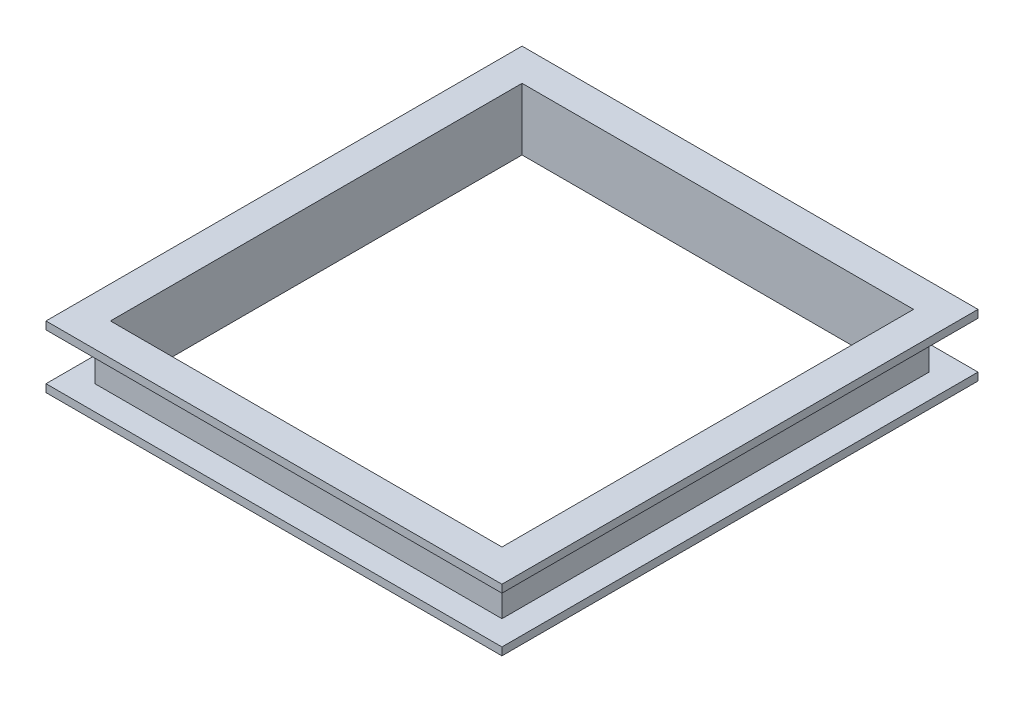
ISO-10303-21;
HEADER;
FILE_DESCRIPTION(('STEP AP214'),'2;1');
FILE_NAME('part.step','',(''),(''),'','','');
FILE_SCHEMA(('AUTOMOTIVE_DESIGN { 1 0 10303 214 1 1 1 1 }'));
ENDSEC;
DATA;
#1=APPLICATION_CONTEXT('core data for automotive mechanical design processes');
#2=APPLICATION_PROTOCOL_DEFINITION('international standard','automotive_design',2000,#1);
#3=PRODUCT_CONTEXT('',#1,'mechanical');
#4=PRODUCT('Part','Part','',(#3));
#5=PRODUCT_RELATED_PRODUCT_CATEGORY('part','',(#4));
#6=PRODUCT_DEFINITION_FORMATION('','',#4);
#7=PRODUCT_DEFINITION_CONTEXT('part definition',#1,'design');
#8=PRODUCT_DEFINITION('design','',#6,#7);
#9=PRODUCT_DEFINITION_SHAPE('','',#8);
#10=(LENGTH_UNIT() NAMED_UNIT(*) SI_UNIT(.MILLI.,.METRE.));
#11=(NAMED_UNIT(*) PLANE_ANGLE_UNIT() SI_UNIT($,.RADIAN.));
#12=(NAMED_UNIT(*) SI_UNIT($,.STERADIAN.) SOLID_ANGLE_UNIT());
#13=UNCERTAINTY_MEASURE_WITH_UNIT(LENGTH_MEASURE(1.E-05),#10,'distance_accuracy_value','');
#14=(GEOMETRIC_REPRESENTATION_CONTEXT(3) GLOBAL_UNCERTAINTY_ASSIGNED_CONTEXT((#13)) GLOBAL_UNIT_ASSIGNED_CONTEXT((#10,
#11,#12)) REPRESENTATION_CONTEXT('',''));
#15=CARTESIAN_POINT('',(0.,0.,0.));
#16=DIRECTION('',(0.,0.,1.));
#17=DIRECTION('',(1.,0.,0.));
#18=AXIS2_PLACEMENT_3D('',#15,#16,#17);
#19=CARTESIAN_POINT('',(0.,8.,0.));
#20=DIRECTION('',(0.,-1.,0.));
#21=DIRECTION('',(0.,0.,-1.));
#22=AXIS2_PLACEMENT_3D('',#19,#20,#21);
#23=PLANE('',#22);
#24=DIRECTION('',(0.,0.,1.));
#25=VECTOR('',#24,1.);
#26=CARTESIAN_POINT('',(-4.15055655745279,8.,0.));
#27=LINE('',#26,#25);
#28=CARTESIAN_POINT('',(-4.15055655745279,8.,-57.19));
#29=VERTEX_POINT('',#28);
#30=CARTESIAN_POINT('',(-4.15055655745279,8.,4.15));
#31=VERTEX_POINT('',#30);
#32=EDGE_CURVE('E271',#29,#31,#27,.T.);
#33=ORIENTED_EDGE('',*,*,#32,.T.);
#34=DIRECTION('',(1.,0.,0.));
#35=VECTOR('',#34,1.);
#36=CARTESIAN_POINT('',(0.,8.,4.15));
#37=LINE('',#36,#35);
#38=CARTESIAN_POINT('',(54.6,8.,4.15));
#39=VERTEX_POINT('',#38);
#40=EDGE_CURVE('E160',#31,#39,#37,.T.);
#41=ORIENTED_EDGE('',*,*,#40,.T.);
#42=DIRECTION('',(0.,0.,-1.));
#43=VECTOR('',#42,1.);
#44=CARTESIAN_POINT('',(54.6,8.,0.));
#45=LINE('',#44,#43);
#46=CARTESIAN_POINT('',(54.6,8.,-57.19));
#47=VERTEX_POINT('',#46);
#48=EDGE_CURVE('E169',#39,#47,#45,.T.);
#49=ORIENTED_EDGE('',*,*,#48,.T.);
#50=DIRECTION('',(-1.,0.,0.));
#51=VECTOR('',#50,1.);
#52=CARTESIAN_POINT('',(0.,8.,-57.19));
#53=LINE('',#52,#51);
#54=EDGE_CURVE('E277',#47,#29,#53,.T.);
#55=ORIENTED_EDGE('',*,*,#54,.T.);
#56=EDGE_LOOP('',(#33,#41,#49,#55));
#57=FACE_BOUND('',#56,.T.);
#58=DIRECTION('',(0.,0.,1.));
#59=VECTOR('',#58,1.);
#60=CARTESIAN_POINT('',(0.,8.,0.));
#61=LINE('',#60,#59);
#62=CARTESIAN_POINT('',(0.,8.,-53.04));
#63=VERTEX_POINT('',#62);
#64=CARTESIAN_POINT('',(0.,8.,0.));
#65=VERTEX_POINT('',#64);
#66=EDGE_CURVE('E201',#63,#65,#61,.T.);
#67=ORIENTED_EDGE('',*,*,#66,.F.);
#68=DIRECTION('',(-1.,0.,0.));
#69=VECTOR('',#68,1.);
#70=CARTESIAN_POINT('',(0.,8.,-53.04));
#71=LINE('',#70,#69);
#72=CARTESIAN_POINT('',(50.45,8.,-53.04));
#73=VERTEX_POINT('',#72);
#74=EDGE_CURVE('E209',#73,#63,#71,.T.);
#75=ORIENTED_EDGE('',*,*,#74,.F.);
#76=DIRECTION('',(0.,0.,-1.));
#77=VECTOR('',#76,1.);
#78=CARTESIAN_POINT('',(50.45,8.,0.));
#79=LINE('',#78,#77);
#80=CARTESIAN_POINT('',(50.45,8.,0.));
#81=VERTEX_POINT('',#80);
#82=EDGE_CURVE('E206',#81,#73,#79,.T.);
#83=ORIENTED_EDGE('',*,*,#82,.F.);
#84=DIRECTION('',(1.,0.,0.));
#85=VECTOR('',#84,1.);
#86=CARTESIAN_POINT('',(0.,8.,0.));
#87=LINE('',#86,#85);
#88=EDGE_CURVE('E203',#65,#81,#87,.T.);
#89=ORIENTED_EDGE('',*,*,#88,.F.);
#90=EDGE_LOOP('',(#67,#75,#83,#89));
#91=FACE_BOUND('',#90,.T.);
#92=ADVANCED_FACE('F33',(#57,#91),#23,.F.);
#93=CARTESIAN_POINT('',(0.,0.,0.));
#94=DIRECTION('',(0.,-1.,0.));
#95=DIRECTION('',(0.,0.,-1.));
#96=AXIS2_PLACEMENT_3D('',#93,#94,#95);
#97=PLANE('',#96);
#98=DIRECTION('',(1.,0.,0.));
#99=VECTOR('',#98,1.);
#100=CARTESIAN_POINT('',(0.,0.,4.15));
#101=LINE('',#100,#99);
#102=CARTESIAN_POINT('',(-4.15055655745279,0.,4.15));
#103=VERTEX_POINT('',#102);
#104=CARTESIAN_POINT('',(54.6,0.,4.15));
#105=VERTEX_POINT('',#104);
#106=EDGE_CURVE('E168',#103,#105,#101,.T.);
#107=ORIENTED_EDGE('',*,*,#106,.F.);
#108=DIRECTION('',(0.,0.,1.));
#109=VECTOR('',#108,1.);
#110=CARTESIAN_POINT('',(-4.15055655745279,0.,0.));
#111=LINE('',#110,#109);
#112=CARTESIAN_POINT('',(-4.15055655745279,0.,-57.19));
#113=VERTEX_POINT('',#112);
#114=EDGE_CURVE('E152',#113,#103,#111,.T.);
#115=ORIENTED_EDGE('',*,*,#114,.F.);
#116=DIRECTION('',(-1.,0.,0.));
#117=VECTOR('',#116,1.);
#118=CARTESIAN_POINT('',(0.,0.,-57.19));
#119=LINE('',#118,#117);
#120=CARTESIAN_POINT('',(54.6,0.,-57.19));
#121=VERTEX_POINT('',#120);
#122=EDGE_CURVE('E275',#121,#113,#119,.T.);
#123=ORIENTED_EDGE('',*,*,#122,.F.);
#124=DIRECTION('',(0.,0.,-1.));
#125=VECTOR('',#124,1.);
#126=CARTESIAN_POINT('',(54.6,0.,0.));
#127=LINE('',#126,#125);
#128=EDGE_CURVE('E173',#105,#121,#127,.T.);
#129=ORIENTED_EDGE('',*,*,#128,.F.);
#130=EDGE_LOOP('',(#107,#115,#123,#129));
#131=FACE_BOUND('',#130,.T.);
#132=DIRECTION('',(-1.,0.,0.));
#133=VECTOR('',#132,1.);
#134=CARTESIAN_POINT('',(0.,0.,-53.04));
#135=LINE('',#134,#133);
#136=CARTESIAN_POINT('',(50.45,0.,-53.04));
#137=VERTEX_POINT('',#136);
#138=CARTESIAN_POINT('',(0.,0.,-53.04));
#139=VERTEX_POINT('',#138);
#140=EDGE_CURVE('E204',#137,#139,#135,.T.);
#141=ORIENTED_EDGE('',*,*,#140,.T.);
#142=DIRECTION('',(0.,0.,1.));
#143=VECTOR('',#142,1.);
#144=CARTESIAN_POINT('',(0.,0.,0.));
#145=LINE('',#144,#143);
#146=CARTESIAN_POINT('',(0.,0.,0.));
#147=VERTEX_POINT('',#146);
#148=EDGE_CURVE('E200',#139,#147,#145,.T.);
#149=ORIENTED_EDGE('',*,*,#148,.T.);
#150=DIRECTION('',(1.,0.,0.));
#151=VECTOR('',#150,1.);
#152=CARTESIAN_POINT('',(0.,0.,0.));
#153=LINE('',#152,#151);
#154=CARTESIAN_POINT('',(50.45,0.,0.));
#155=VERTEX_POINT('',#154);
#156=EDGE_CURVE('E214',#147,#155,#153,.T.);
#157=ORIENTED_EDGE('',*,*,#156,.T.);
#158=DIRECTION('',(0.,0.,-1.));
#159=VECTOR('',#158,1.);
#160=CARTESIAN_POINT('',(50.45,0.,0.));
#161=LINE('',#160,#159);
#162=EDGE_CURVE('E217',#155,#137,#161,.T.);
#163=ORIENTED_EDGE('',*,*,#162,.T.);
#164=EDGE_LOOP('',(#141,#149,#157,#163));
#165=FACE_BOUND('',#164,.T.);
#166=ADVANCED_FACE('F35',(#131,#165),#97,.T.);
#167=CARTESIAN_POINT('',(0.,8.,0.));
#168=DIRECTION('',(1.,0.,0.));
#169=DIRECTION('',(0.,0.,-1.));
#170=AXIS2_PLACEMENT_3D('',#167,#168,#169);
#171=PLANE('',#170);
#172=ORIENTED_EDGE('',*,*,#148,.F.);
#173=DIRECTION('',(0.,-1.,0.));
#174=VECTOR('',#173,1.);
#175=CARTESIAN_POINT('',(0.,8.,-53.04));
#176=LINE('',#175,#174);
#177=EDGE_CURVE('E211',#63,#139,#176,.T.);
#178=ORIENTED_EDGE('',*,*,#177,.F.);
#179=ORIENTED_EDGE('',*,*,#66,.T.);
#180=DIRECTION('',(0.,-1.,0.));
#181=VECTOR('',#180,1.);
#182=CARTESIAN_POINT('',(0.,8.,0.));
#183=LINE('',#182,#181);
#184=EDGE_CURVE('E228',#65,#147,#183,.T.);
#185=ORIENTED_EDGE('',*,*,#184,.T.);
#186=EDGE_LOOP('',(#172,#178,#179,#185));
#187=FACE_BOUND('',#186,.T.);
#188=ADVANCED_FACE('F308',(#187),#171,.T.);
#189=CARTESIAN_POINT('',(0.,8.,0.));
#190=DIRECTION('',(0.,0.,-1.));
#191=DIRECTION('',(-1.,0.,0.));
#192=AXIS2_PLACEMENT_3D('',#189,#190,#191);
#193=PLANE('',#192);
#194=ORIENTED_EDGE('',*,*,#156,.F.);
#195=ORIENTED_EDGE('',*,*,#184,.F.);
#196=ORIENTED_EDGE('',*,*,#88,.T.);
#197=DIRECTION('',(0.,-1.,0.));
#198=VECTOR('',#197,1.);
#199=CARTESIAN_POINT('',(50.45,8.,0.));
#200=LINE('',#199,#198);
#201=EDGE_CURVE('E226',#81,#155,#200,.T.);
#202=ORIENTED_EDGE('',*,*,#201,.T.);
#203=EDGE_LOOP('',(#194,#195,#196,#202));
#204=FACE_BOUND('',#203,.T.);
#205=ADVANCED_FACE('F313',(#204),#193,.T.);
#206=CARTESIAN_POINT('',(50.45,8.,0.));
#207=DIRECTION('',(-1.,0.,0.));
#208=DIRECTION('',(0.,0.,1.));
#209=AXIS2_PLACEMENT_3D('',#206,#207,#208);
#210=PLANE('',#209);
#211=ORIENTED_EDGE('',*,*,#162,.F.);
#212=ORIENTED_EDGE('',*,*,#201,.F.);
#213=ORIENTED_EDGE('',*,*,#82,.T.);
#214=DIRECTION('',(0.,-1.,0.));
#215=VECTOR('',#214,1.);
#216=CARTESIAN_POINT('',(50.45,8.,-53.04));
#217=LINE('',#216,#215);
#218=EDGE_CURVE('E224',#73,#137,#217,.T.);
#219=ORIENTED_EDGE('',*,*,#218,.T.);
#220=EDGE_LOOP('',(#211,#212,#213,#219));
#221=FACE_BOUND('',#220,.T.);
#222=ADVANCED_FACE('F297',(#221),#210,.T.);
#223=CARTESIAN_POINT('',(0.,8.,-53.04));
#224=DIRECTION('',(0.,0.,1.));
#225=DIRECTION('',(1.,0.,0.));
#226=AXIS2_PLACEMENT_3D('',#223,#224,#225);
#227=PLANE('',#226);
#228=ORIENTED_EDGE('',*,*,#140,.F.);
#229=ORIENTED_EDGE('',*,*,#218,.F.);
#230=ORIENTED_EDGE('',*,*,#74,.T.);
#231=ORIENTED_EDGE('',*,*,#177,.T.);
#232=EDGE_LOOP('',(#228,#229,#230,#231));
#233=FACE_BOUND('',#232,.T.);
#234=ADVANCED_FACE('F288',(#233),#227,.T.);
#235=CARTESIAN_POINT('',(-4.15055655745279,29.,-26.52));
#236=DIRECTION('',(1.,0.,0.));
#237=DIRECTION('',(0.,0.,-1.));
#238=AXIS2_PLACEMENT_3D('',#235,#236,#237);
#239=PLANE('',#238);
#240=ORIENTED_EDGE('',*,*,#114,.T.);
#241=DIRECTION('',(0.,-1.,0.));
#242=VECTOR('',#241,1.);
#243=CARTESIAN_POINT('',(-4.15055655745279,29.,4.15));
#244=LINE('',#243,#242);
#245=CARTESIAN_POINT('',(-4.15055655745279,1.,4.15));
#246=VERTEX_POINT('',#245);
#247=EDGE_CURVE('E162',#246,#103,#244,.T.);
#248=ORIENTED_EDGE('',*,*,#247,.F.);
#249=DIRECTION('',(0.,0.,1.));
#250=VECTOR('',#249,1.);
#251=CARTESIAN_POINT('',(-4.15055655745279,1.,1.));
#252=LINE('',#251,#250);
#253=CARTESIAN_POINT('',(-4.15055655745279,1.,-57.19));
#254=VERTEX_POINT('',#253);
#255=EDGE_CURVE('E240',#254,#246,#252,.T.);
#256=ORIENTED_EDGE('',*,*,#255,.F.);
#257=DIRECTION('',(0.,-1.,0.));
#258=VECTOR('',#257,1.);
#259=CARTESIAN_POINT('',(-4.15055655745279,29.,-57.19));
#260=LINE('',#259,#258);
#261=EDGE_CURVE('E56',#254,#113,#260,.T.);
#262=ORIENTED_EDGE('',*,*,#261,.T.);
#263=EDGE_LOOP('',(#240,#248,#256,#262));
#264=FACE_BOUND('',#263,.T.);
#265=ADVANCED_FACE('F286',(#264),#239,.F.);
#266=CARTESIAN_POINT('',(-4.15055655745279,29.,-57.19));
#267=DIRECTION('',(0.,0.,1.));
#268=DIRECTION('',(1.,0.,0.));
#269=AXIS2_PLACEMENT_3D('',#266,#267,#268);
#270=PLANE('',#269);
#271=ORIENTED_EDGE('',*,*,#122,.T.);
#272=ORIENTED_EDGE('',*,*,#261,.F.);
#273=DIRECTION('',(-1.,0.,0.));
#274=VECTOR('',#273,1.);
#275=CARTESIAN_POINT('',(72.5725958693623,1.,-57.19));
#276=LINE('',#275,#274);
#277=CARTESIAN_POINT('',(54.6,1.,-57.19));
#278=VERTEX_POINT('',#277);
#279=EDGE_CURVE('E243',#278,#254,#276,.T.);
#280=ORIENTED_EDGE('',*,*,#279,.F.);
#281=DIRECTION('',(0.,-1.,0.));
#282=VECTOR('',#281,1.);
#283=CARTESIAN_POINT('',(54.6,29.,-57.19));
#284=LINE('',#283,#282);
#285=EDGE_CURVE('E258',#278,#121,#284,.T.);
#286=ORIENTED_EDGE('',*,*,#285,.T.);
#287=EDGE_LOOP('',(#271,#272,#280,#286));
#288=FACE_BOUND('',#287,.T.);
#289=ADVANCED_FACE('F283',(#288),#270,.F.);
#290=CARTESIAN_POINT('',(54.6,29.,-57.19));
#291=DIRECTION('',(-1.,0.,0.));
#292=DIRECTION('',(0.,0.,1.));
#293=AXIS2_PLACEMENT_3D('',#290,#291,#292);
#294=PLANE('',#293);
#295=ORIENTED_EDGE('',*,*,#128,.T.);
#296=ORIENTED_EDGE('',*,*,#285,.F.);
#297=DIRECTION('',(0.,0.,-1.));
#298=VECTOR('',#297,1.);
#299=CARTESIAN_POINT('',(54.6,1.,1.));
#300=LINE('',#299,#298);
#301=CARTESIAN_POINT('',(54.6,1.,4.15));
#302=VERTEX_POINT('',#301);
#303=EDGE_CURVE('E41',#302,#278,#300,.T.);
#304=ORIENTED_EDGE('',*,*,#303,.F.);
#305=DIRECTION('',(0.,-1.,0.));
#306=VECTOR('',#305,1.);
#307=CARTESIAN_POINT('',(54.6,29.,4.15));
#308=LINE('',#307,#306);
#309=EDGE_CURVE('E255',#302,#105,#308,.T.);
#310=ORIENTED_EDGE('',*,*,#309,.T.);
#311=EDGE_LOOP('',(#295,#296,#304,#310));
#312=FACE_BOUND('',#311,.T.);
#313=ADVANCED_FACE('F254',(#312),#294,.F.);
#314=CARTESIAN_POINT('',(54.6,29.,4.15));
#315=DIRECTION('',(0.,0.,-1.));
#316=DIRECTION('',(-1.,0.,0.));
#317=AXIS2_PLACEMENT_3D('',#314,#315,#316);
#318=PLANE('',#317);
#319=ORIENTED_EDGE('',*,*,#106,.T.);
#320=ORIENTED_EDGE('',*,*,#309,.F.);
#321=DIRECTION('',(1.,0.,0.));
#322=VECTOR('',#321,1.);
#323=CARTESIAN_POINT('',(72.5725958693623,1.,4.15));
#324=LINE('',#323,#322);
#325=EDGE_CURVE('E11',#246,#302,#324,.T.);
#326=ORIENTED_EDGE('',*,*,#325,.F.);
#327=ORIENTED_EDGE('',*,*,#247,.T.);
#328=EDGE_LOOP('',(#319,#320,#326,#327));
#329=FACE_BOUND('',#328,.T.);
#330=ADVANCED_FACE('F260',(#329),#318,.F.);
#331=CARTESIAN_POINT('',(-4.15055655745279,7.,4.15));
#332=VERTEX_POINT('',#331);
#333=EDGE_CURVE('E48',#31,#332,#244,.T.);
#334=ORIENTED_EDGE('',*,*,#333,.T.);
#335=DIRECTION('',(-1.,0.,0.));
#336=VECTOR('',#335,1.);
#337=CARTESIAN_POINT('',(-7.,7.,4.15));
#338=LINE('',#337,#336);
#339=CARTESIAN_POINT('',(54.6,7.,4.15));
#340=VERTEX_POINT('',#339);
#341=EDGE_CURVE('E157',#340,#332,#338,.T.);
#342=ORIENTED_EDGE('',*,*,#341,.F.);
#343=EDGE_CURVE('E263',#39,#340,#308,.T.);
#344=ORIENTED_EDGE('',*,*,#343,.F.);
#345=ORIENTED_EDGE('',*,*,#40,.F.);
#346=EDGE_LOOP('',(#334,#342,#344,#345));
#347=FACE_BOUND('',#346,.T.);
#348=ADVANCED_FACE('F155',(#347),#318,.F.);
#349=ORIENTED_EDGE('',*,*,#343,.T.);
#350=DIRECTION('',(0.,0.,1.));
#351=VECTOR('',#350,1.);
#352=CARTESIAN_POINT('',(54.6,7.,1.));
#353=LINE('',#352,#351);
#354=CARTESIAN_POINT('',(54.6,7.,-57.19));
#355=VERTEX_POINT('',#354);
#356=EDGE_CURVE('E167',#355,#340,#353,.T.);
#357=ORIENTED_EDGE('',*,*,#356,.F.);
#358=EDGE_CURVE('E264',#47,#355,#284,.T.);
#359=ORIENTED_EDGE('',*,*,#358,.F.);
#360=ORIENTED_EDGE('',*,*,#48,.F.);
#361=EDGE_LOOP('',(#349,#357,#359,#360));
#362=FACE_BOUND('',#361,.T.);
#363=ADVANCED_FACE('F341',(#362),#294,.F.);
#364=ORIENTED_EDGE('',*,*,#358,.T.);
#365=DIRECTION('',(1.,0.,0.));
#366=VECTOR('',#365,1.);
#367=CARTESIAN_POINT('',(-7.,7.,-57.19));
#368=LINE('',#367,#366);
#369=CARTESIAN_POINT('',(-4.15055655745279,7.,-57.19));
#370=VERTEX_POINT('',#369);
#371=EDGE_CURVE('E273',#370,#355,#368,.T.);
#372=ORIENTED_EDGE('',*,*,#371,.F.);
#373=EDGE_CURVE('E147',#29,#370,#260,.T.);
#374=ORIENTED_EDGE('',*,*,#373,.F.);
#375=ORIENTED_EDGE('',*,*,#54,.F.);
#376=EDGE_LOOP('',(#364,#372,#374,#375));
#377=FACE_BOUND('',#376,.T.);
#378=ADVANCED_FACE('F295',(#377),#270,.F.);
#379=ORIENTED_EDGE('',*,*,#373,.T.);
#380=DIRECTION('',(0.,0.,-1.));
#381=VECTOR('',#380,1.);
#382=CARTESIAN_POINT('',(-4.15055655745279,7.,1.));
#383=LINE('',#382,#381);
#384=EDGE_CURVE('E144',#332,#370,#383,.T.);
#385=ORIENTED_EDGE('',*,*,#384,.F.);
#386=ORIENTED_EDGE('',*,*,#333,.F.);
#387=ORIENTED_EDGE('',*,*,#32,.F.);
#388=EDGE_LOOP('',(#379,#385,#386,#387));
#389=FACE_BOUND('',#388,.T.);
#390=ADVANCED_FACE('F145',(#389),#239,.F.);
#391=CARTESIAN_POINT('',(0.,0.,-54.04));
#392=DIRECTION('',(0.,0.,1.));
#393=DIRECTION('',(1.,0.,0.));
#394=AXIS2_PLACEMENT_3D('',#391,#392,#393);
#395=PLANE('',#394);
#396=DIRECTION('',(1.,0.,0.));
#397=VECTOR('',#396,1.);
#398=CARTESIAN_POINT('',(-11.8380303022014,7.,-54.04));
#399=LINE('',#398,#397);
#400=CARTESIAN_POINT('',(-1.,7.,-54.04));
#401=VERTEX_POINT('',#400);
#402=CARTESIAN_POINT('',(51.45,7.,-54.04));
#403=VERTEX_POINT('',#402);
#404=EDGE_CURVE('E185',#401,#403,#399,.T.);
#405=ORIENTED_EDGE('',*,*,#404,.T.);
#406=DIRECTION('',(0.,-1.,0.));
#407=VECTOR('',#406,1.);
#408=CARTESIAN_POINT('',(51.45,0.,-54.04));
#409=LINE('',#408,#407);
#410=CARTESIAN_POINT('',(51.45,1.,-54.04));
#411=VERTEX_POINT('',#410);
#412=EDGE_CURVE('E237',#403,#411,#409,.T.);
#413=ORIENTED_EDGE('',*,*,#412,.T.);
#414=DIRECTION('',(-1.,0.,0.));
#415=VECTOR('',#414,1.);
#416=CARTESIAN_POINT('',(-1.,1.,-54.04));
#417=LINE('',#416,#415);
#418=CARTESIAN_POINT('',(-1.,1.,-54.04));
#419=VERTEX_POINT('',#418);
#420=EDGE_CURVE('E188',#411,#419,#417,.T.);
#421=ORIENTED_EDGE('',*,*,#420,.T.);
#422=DIRECTION('',(0.,-1.,0.));
#423=VECTOR('',#422,1.);
#424=CARTESIAN_POINT('',(-1.,0.,-54.04));
#425=LINE('',#424,#423);
#426=EDGE_CURVE('E234',#401,#419,#425,.T.);
#427=ORIENTED_EDGE('',*,*,#426,.F.);
#428=EDGE_LOOP('',(#405,#413,#421,#427));
#429=FACE_BOUND('',#428,.T.);
#430=ADVANCED_FACE('F301',(#429),#395,.F.);
#431=CARTESIAN_POINT('',(-1.,0.,0.));
#432=DIRECTION('',(1.,0.,0.));
#433=DIRECTION('',(0.,0.,-1.));
#434=AXIS2_PLACEMENT_3D('',#431,#432,#433);
#435=PLANE('',#434);
#436=DIRECTION('',(0.,0.,-1.));
#437=VECTOR('',#436,1.);
#438=CARTESIAN_POINT('',(-1.,7.,1.));
#439=LINE('',#438,#437);
#440=CARTESIAN_POINT('',(-1.,7.,1.));
#441=VERTEX_POINT('',#440);
#442=EDGE_CURVE('E190',#441,#401,#439,.T.);
#443=ORIENTED_EDGE('',*,*,#442,.T.);
#444=ORIENTED_EDGE('',*,*,#426,.T.);
#445=DIRECTION('',(0.,0.,1.));
#446=VECTOR('',#445,1.);
#447=CARTESIAN_POINT('',(-1.,1.,1.));
#448=LINE('',#447,#446);
#449=CARTESIAN_POINT('',(-1.,1.,1.));
#450=VERTEX_POINT('',#449);
#451=EDGE_CURVE('E193',#419,#450,#448,.T.);
#452=ORIENTED_EDGE('',*,*,#451,.T.);
#453=DIRECTION('',(0.,-1.,0.));
#454=VECTOR('',#453,1.);
#455=CARTESIAN_POINT('',(-1.,0.,1.));
#456=LINE('',#455,#454);
#457=EDGE_CURVE('E231',#441,#450,#456,.T.);
#458=ORIENTED_EDGE('',*,*,#457,.F.);
#459=EDGE_LOOP('',(#443,#444,#452,#458));
#460=FACE_BOUND('',#459,.T.);
#461=ADVANCED_FACE('F329',(#460),#435,.F.);
#462=CARTESIAN_POINT('',(0.,0.,1.));
#463=DIRECTION('',(0.,0.,-1.));
#464=DIRECTION('',(-1.,0.,0.));
#465=AXIS2_PLACEMENT_3D('',#462,#463,#464);
#466=PLANE('',#465);
#467=DIRECTION('',(1.,0.,0.));
#468=VECTOR('',#467,1.);
#469=CARTESIAN_POINT('',(72.5725958693623,1.,1.));
#470=LINE('',#469,#468);
#471=CARTESIAN_POINT('',(51.45,1.,1.));
#472=VERTEX_POINT('',#471);
#473=EDGE_CURVE('E197',#450,#472,#470,.T.);
#474=ORIENTED_EDGE('',*,*,#473,.T.);
#475=DIRECTION('',(0.,1.,0.));
#476=VECTOR('',#475,1.);
#477=CARTESIAN_POINT('',(51.45,0.,1.));
#478=LINE('',#477,#476);
#479=CARTESIAN_POINT('',(51.45,7.,1.));
#480=VERTEX_POINT('',#479);
#481=EDGE_CURVE('E182',#472,#480,#478,.T.);
#482=ORIENTED_EDGE('',*,*,#481,.T.);
#483=DIRECTION('',(-1.,0.,0.));
#484=VECTOR('',#483,1.);
#485=CARTESIAN_POINT('',(-15.0830794436315,7.,1.));
#486=LINE('',#485,#484);
#487=EDGE_CURVE('E195',#480,#441,#486,.T.);
#488=ORIENTED_EDGE('',*,*,#487,.T.);
#489=ORIENTED_EDGE('',*,*,#457,.T.);
#490=EDGE_LOOP('',(#474,#482,#488,#489));
#491=FACE_BOUND('',#490,.T.);
#492=ADVANCED_FACE('F326',(#491),#466,.F.);
#493=CARTESIAN_POINT('',(-7.,7.,1.));
#494=DIRECTION('',(0.,1.,0.));
#495=DIRECTION('',(0.,0.,1.));
#496=AXIS2_PLACEMENT_3D('',#493,#494,#495);
#497=PLANE('',#496);
#498=ORIENTED_EDGE('',*,*,#356,.T.);
#499=ORIENTED_EDGE('',*,*,#341,.T.);
#500=ORIENTED_EDGE('',*,*,#384,.T.);
#501=ORIENTED_EDGE('',*,*,#371,.T.);
#502=EDGE_LOOP('',(#498,#499,#500,#501));
#503=FACE_BOUND('',#502,.T.);
#504=DIRECTION('',(0.,0.,1.));
#505=VECTOR('',#504,1.);
#506=CARTESIAN_POINT('',(51.45,7.,1.));
#507=LINE('',#506,#505);
#508=EDGE_CURVE('E178',#403,#480,#507,.T.);
#509=ORIENTED_EDGE('',*,*,#508,.F.);
#510=ORIENTED_EDGE('',*,*,#404,.F.);
#511=ORIENTED_EDGE('',*,*,#442,.F.);
#512=ORIENTED_EDGE('',*,*,#487,.F.);
#513=EDGE_LOOP('',(#509,#510,#511,#512));
#514=FACE_BOUND('',#513,.T.);
#515=ADVANCED_FACE('F165',(#503,#514),#497,.F.);
#516=CARTESIAN_POINT('',(51.45,0.,0.));
#517=DIRECTION('',(-1.,0.,0.));
#518=DIRECTION('',(0.,0.,1.));
#519=AXIS2_PLACEMENT_3D('',#516,#517,#518);
#520=PLANE('',#519);
#521=DIRECTION('',(0.,0.,-1.));
#522=VECTOR('',#521,1.);
#523=CARTESIAN_POINT('',(51.45,1.,1.));
#524=LINE('',#523,#522);
#525=EDGE_CURVE('E180',#472,#411,#524,.T.);
#526=ORIENTED_EDGE('',*,*,#525,.T.);
#527=ORIENTED_EDGE('',*,*,#412,.F.);
#528=ORIENTED_EDGE('',*,*,#508,.T.);
#529=ORIENTED_EDGE('',*,*,#481,.F.);
#530=EDGE_LOOP('',(#526,#527,#528,#529));
#531=FACE_BOUND('',#530,.T.);
#532=ADVANCED_FACE('F323',(#531),#520,.F.);
#533=CARTESIAN_POINT('',(72.5725958693623,1.,1.));
#534=DIRECTION('',(0.,-1.,0.));
#535=DIRECTION('',(0.,0.,-1.));
#536=AXIS2_PLACEMENT_3D('',#533,#534,#535);
#537=PLANE('',#536);
#538=ORIENTED_EDGE('',*,*,#255,.T.);
#539=ORIENTED_EDGE('',*,*,#325,.T.);
#540=ORIENTED_EDGE('',*,*,#303,.T.);
#541=ORIENTED_EDGE('',*,*,#279,.T.);
#542=EDGE_LOOP('',(#538,#539,#540,#541));
#543=FACE_BOUND('',#542,.T.);
#544=ORIENTED_EDGE('',*,*,#525,.F.);
#545=ORIENTED_EDGE('',*,*,#473,.F.);
#546=ORIENTED_EDGE('',*,*,#451,.F.);
#547=ORIENTED_EDGE('',*,*,#420,.F.);
#548=EDGE_LOOP('',(#544,#545,#546,#547));
#549=FACE_BOUND('',#548,.T.);
#550=ADVANCED_FACE('F247',(#543,#549),#537,.F.);
#551=CLOSED_SHELL('',(#92,#166,#188,#205,#222,#234,#265,#289,#313,#330,#348,#363,#378,#390,#430,
#461,#492,#515,#532,#550));
#552=MANIFOLD_SOLID_BREP('B2',#551);
#553=ADVANCED_BREP_SHAPE_REPRESENTATION('',(#18,#552),#14);
#554=SHAPE_DEFINITION_REPRESENTATION(#9,#553);
ENDSEC;
END-ISO-10303-21;
